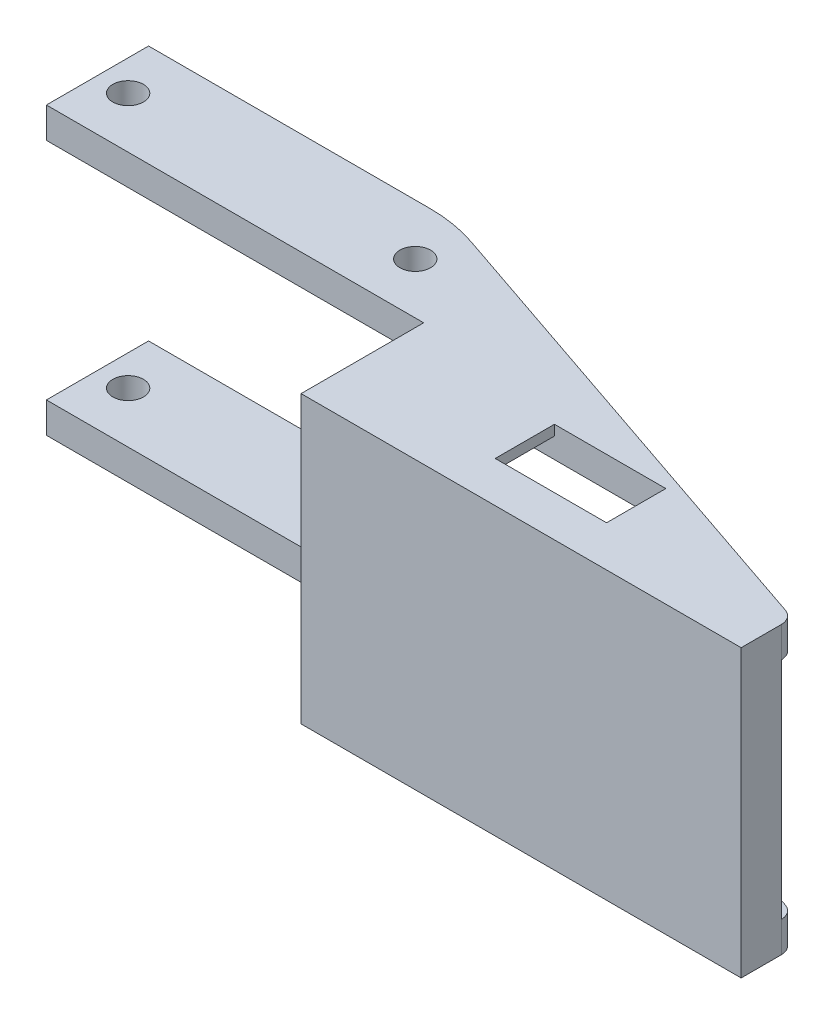
ISO-10303-21;
HEADER;
FILE_DESCRIPTION(('STEP AP214'),'2;1');
FILE_NAME('part.step','',(''),(''),'','','');
FILE_SCHEMA(('AUTOMOTIVE_DESIGN { 1 0 10303 214 1 1 1 1 }'));
ENDSEC;
DATA;
#1=APPLICATION_CONTEXT('core data for automotive mechanical design processes');
#2=APPLICATION_PROTOCOL_DEFINITION('international standard','automotive_design',2000,#1);
#3=PRODUCT_CONTEXT('',#1,'mechanical');
#4=PRODUCT('Part','Part','',(#3));
#5=PRODUCT_RELATED_PRODUCT_CATEGORY('part','',(#4));
#6=PRODUCT_DEFINITION_FORMATION('','',#4);
#7=PRODUCT_DEFINITION_CONTEXT('part definition',#1,'design');
#8=PRODUCT_DEFINITION('design','',#6,#7);
#9=PRODUCT_DEFINITION_SHAPE('','',#8);
#10=(LENGTH_UNIT() NAMED_UNIT(*) SI_UNIT(.MILLI.,.METRE.));
#11=(NAMED_UNIT(*) PLANE_ANGLE_UNIT() SI_UNIT($,.RADIAN.));
#12=(NAMED_UNIT(*) SI_UNIT($,.STERADIAN.) SOLID_ANGLE_UNIT());
#13=UNCERTAINTY_MEASURE_WITH_UNIT(LENGTH_MEASURE(1.E-05),#10,'distance_accuracy_value','');
#14=(GEOMETRIC_REPRESENTATION_CONTEXT(3) GLOBAL_UNCERTAINTY_ASSIGNED_CONTEXT((#13)) GLOBAL_UNIT_ASSIGNED_CONTEXT((#10,
#11,#12)) REPRESENTATION_CONTEXT('',''));
#15=CARTESIAN_POINT('',(0.,0.,0.));
#16=DIRECTION('',(0.,0.,1.));
#17=DIRECTION('',(1.,0.,0.));
#18=AXIS2_PLACEMENT_3D('',#15,#16,#17);
#19=CARTESIAN_POINT('',(13.,15.,2.04529828109201));
#20=DIRECTION('',(-1.,0.,0.));
#21=DIRECTION('',(0.,0.,1.));
#22=AXIS2_PLACEMENT_3D('',#19,#20,#21);
#23=PLANE('',#22);
#24=DIRECTION('',(0.,0.,-1.));
#25=VECTOR('',#24,1.);
#26=CARTESIAN_POINT('',(13.,24.,7.84529828109201));
#27=LINE('',#26,#25);
#28=CARTESIAN_POINT('',(13.,24.,7.84529828109201));
#29=VERTEX_POINT('',#28);
#30=CARTESIAN_POINT('',(13.,24.,2.04529828109201));
#31=VERTEX_POINT('',#30);
#32=EDGE_CURVE('E202',#29,#31,#27,.T.);
#33=ORIENTED_EDGE('',*,*,#32,.F.);
#34=DIRECTION('',(0.,1.,0.));
#35=VECTOR('',#34,1.);
#36=CARTESIAN_POINT('',(13.,15.,7.84529828109201));
#37=LINE('',#36,#35);
#38=CARTESIAN_POINT('',(13.,22.,7.84529828109201));
#39=VERTEX_POINT('',#38);
#40=EDGE_CURVE('E207',#39,#29,#37,.T.);
#41=ORIENTED_EDGE('',*,*,#40,.F.);
#42=DIRECTION('',(0.,0.,-1.));
#43=VECTOR('',#42,1.);
#44=CARTESIAN_POINT('',(13.,22.,4.84529828109201));
#45=LINE('',#44,#43);
#46=CARTESIAN_POINT('',(13.,22.,2.04529828109201));
#47=VERTEX_POINT('',#46);
#48=EDGE_CURVE('E233',#39,#47,#45,.T.);
#49=ORIENTED_EDGE('',*,*,#48,.T.);
#50=DIRECTION('',(0.,1.,0.));
#51=VECTOR('',#50,1.);
#52=CARTESIAN_POINT('',(13.,15.,2.04529828109201));
#53=LINE('',#52,#51);
#54=EDGE_CURVE('E220',#47,#31,#53,.T.);
#55=ORIENTED_EDGE('',*,*,#54,.T.);
#56=EDGE_LOOP('',(#33,#41,#49,#55));
#57=FACE_BOUND('',#56,.T.);
#58=ADVANCED_FACE('F33',(#57),#23,.F.);
#59=CARTESIAN_POINT('',(13.,15.,2.04529828109201));
#60=DIRECTION('',(0.,0.,-1.));
#61=DIRECTION('',(-1.,0.,0.));
#62=AXIS2_PLACEMENT_3D('',#59,#60,#61);
#63=PLANE('',#62);
#64=DIRECTION('',(-1.,0.,0.));
#65=VECTOR('',#64,1.);
#66=CARTESIAN_POINT('',(15.,24.,2.04529828109201));
#67=LINE('',#66,#65);
#68=CARTESIAN_POINT('',(15.,24.,2.04529828109201));
#69=VERTEX_POINT('',#68);
#70=EDGE_CURVE('E195',#69,#31,#67,.T.);
#71=ORIENTED_EDGE('',*,*,#70,.T.);
#72=ORIENTED_EDGE('',*,*,#54,.F.);
#73=DIRECTION('',(1.,0.,0.));
#74=VECTOR('',#73,1.);
#75=CARTESIAN_POINT('',(-9.406467809383,22.,2.04529828109201));
#76=LINE('',#75,#74);
#77=CARTESIAN_POINT('',(25.9,22.,2.04529828109201));
#78=VERTEX_POINT('',#77);
#79=EDGE_CURVE('E231',#47,#78,#76,.T.);
#80=ORIENTED_EDGE('',*,*,#79,.T.);
#81=DIRECTION('',(0.,1.,0.));
#82=VECTOR('',#81,1.);
#83=CARTESIAN_POINT('',(25.9,15.,2.04529828109201));
#84=LINE('',#83,#82);
#85=CARTESIAN_POINT('',(25.9,25.,2.04529828109201));
#86=VERTEX_POINT('',#85);
#87=EDGE_CURVE('E224',#78,#86,#84,.T.);
#88=ORIENTED_EDGE('',*,*,#87,.T.);
#89=DIRECTION('',(-1.,0.,0.));
#90=VECTOR('',#89,1.);
#91=CARTESIAN_POINT('',(13.,25.,2.04529828109201));
#92=LINE('',#91,#90);
#93=CARTESIAN_POINT('',(15.,25.,2.04529828109201));
#94=VERTEX_POINT('',#93);
#95=EDGE_CURVE('E217',#86,#94,#92,.T.);
#96=ORIENTED_EDGE('',*,*,#95,.T.);
#97=DIRECTION('',(0.,1.,0.));
#98=VECTOR('',#97,1.);
#99=CARTESIAN_POINT('',(15.,25.,2.04529828109201));
#100=LINE('',#99,#98);
#101=EDGE_CURVE('E197',#69,#94,#100,.T.);
#102=ORIENTED_EDGE('',*,*,#101,.F.);
#103=EDGE_LOOP('',(#71,#72,#80,#88,#96,#102));
#104=FACE_BOUND('',#103,.T.);
#105=ADVANCED_FACE('F473',(#104),#63,.F.);
#106=CARTESIAN_POINT('',(13.,15.,7.84529828109201));
#107=DIRECTION('',(0.,0.,1.));
#108=DIRECTION('',(1.,0.,0.));
#109=AXIS2_PLACEMENT_3D('',#106,#107,#108);
#110=PLANE('',#109);
#111=DIRECTION('',(-1.,0.,0.));
#112=VECTOR('',#111,1.);
#113=CARTESIAN_POINT('',(15.,24.,7.84529828109201));
#114=LINE('',#113,#112);
#115=CARTESIAN_POINT('',(15.,24.,7.84529828109201));
#116=VERTEX_POINT('',#115);
#117=EDGE_CURVE('E192',#116,#29,#114,.T.);
#118=ORIENTED_EDGE('',*,*,#117,.F.);
#119=DIRECTION('',(0.,-1.,0.));
#120=VECTOR('',#119,1.);
#121=CARTESIAN_POINT('',(15.,25.,7.84529828109201));
#122=LINE('',#121,#120);
#123=CARTESIAN_POINT('',(15.,25.,7.84529828109201));
#124=VERTEX_POINT('',#123);
#125=EDGE_CURVE('E198',#124,#116,#122,.T.);
#126=ORIENTED_EDGE('',*,*,#125,.F.);
#127=DIRECTION('',(1.,0.,0.));
#128=VECTOR('',#127,1.);
#129=CARTESIAN_POINT('',(13.,25.,7.84529828109201));
#130=LINE('',#129,#128);
#131=CARTESIAN_POINT('',(25.9,25.,7.84529828109201));
#132=VERTEX_POINT('',#131);
#133=EDGE_CURVE('E208',#124,#132,#130,.T.);
#134=ORIENTED_EDGE('',*,*,#133,.T.);
#135=DIRECTION('',(0.,1.,0.));
#136=VECTOR('',#135,1.);
#137=CARTESIAN_POINT('',(25.9,15.,7.84529828109201));
#138=LINE('',#137,#136);
#139=CARTESIAN_POINT('',(25.9,22.,7.84529828109201));
#140=VERTEX_POINT('',#139);
#141=EDGE_CURVE('E58',#140,#132,#138,.T.);
#142=ORIENTED_EDGE('',*,*,#141,.F.);
#143=DIRECTION('',(-1.,0.,0.));
#144=VECTOR('',#143,1.);
#145=CARTESIAN_POINT('',(-9.406467809383,22.,7.84529828109201));
#146=LINE('',#145,#144);
#147=EDGE_CURVE('E223',#140,#39,#146,.T.);
#148=ORIENTED_EDGE('',*,*,#147,.T.);
#149=ORIENTED_EDGE('',*,*,#40,.T.);
#150=EDGE_LOOP('',(#118,#126,#134,#142,#148,#149));
#151=FACE_BOUND('',#150,.T.);
#152=ADVANCED_FACE('F205',(#151),#110,.F.);
#153=CARTESIAN_POINT('',(-9.406467809383,0.,4.84529828109201));
#154=DIRECTION('',(0.,-1.,0.));
#155=DIRECTION('',(0.,0.,-1.));
#156=AXIS2_PLACEMENT_3D('',#153,#154,#155);
#157=PLANE('',#156);
#158=CARTESIAN_POINT('',(-5.82618806875632,0.,-5.15470171890799));
#159=DIRECTION('',(0.,-1.,0.));
#160=DIRECTION('',(0.,0.,-1.));
#161=AXIS2_PLACEMENT_3D('',#158,#159,#160);
#162=CIRCLE('',#161,1.5);
#163=CARTESIAN_POINT('',(-5.82618806875632,0.,-6.65470171890798));
#164=VERTEX_POINT('',#163);
#165=EDGE_CURVE('E321',#164,#164,#162,.T.);
#166=ORIENTED_EDGE('',*,*,#165,.T.);
#167=EDGE_LOOP('',(#166));
#168=FACE_BOUND('',#167,.T.);
#169=CARTESIAN_POINT('',(-33.9261880687563,0.,-5.15470171890799));
#170=DIRECTION('',(0.,-1.,0.));
#171=DIRECTION('',(0.,0.,-1.));
#172=AXIS2_PLACEMENT_3D('',#169,#170,#171);
#173=CIRCLE('',#172,1.49999999999999);
#174=CARTESIAN_POINT('',(-33.9261880687563,0.,-6.65470171890798));
#175=VERTEX_POINT('',#174);
#176=EDGE_CURVE('E37',#175,#175,#173,.T.);
#177=ORIENTED_EDGE('',*,*,#176,.T.);
#178=EDGE_LOOP('',(#177));
#179=FACE_BOUND('',#178,.T.);
#180=DIRECTION('',(-1.,0.,0.));
#181=VECTOR('',#180,1.);
#182=CARTESIAN_POINT('',(0.,0.,7.91962779227332));
#183=LINE('',#182,#181);
#184=CARTESIAN_POINT('',(43.0738119312437,0.,7.91962779227332));
#185=VERTEX_POINT('',#184);
#186=CARTESIAN_POINT('',(0.,0.,7.91962779227332));
#187=VERTEX_POINT('',#186);
#188=EDGE_CURVE('E303',#185,#187,#183,.T.);
#189=ORIENTED_EDGE('',*,*,#188,.F.);
#190=CARTESIAN_POINT('',(41.5738119312437,0.,7.91962779227332));
#191=DIRECTION('',(0.,1.,0.));
#192=DIRECTION('',(0.,0.,-1.));
#193=AXIS2_PLACEMENT_3D('',#190,#191,#192);
#194=CIRCLE('',#193,1.5);
#195=CARTESIAN_POINT('',(42.0566660311017,0.,6.49946867504375));
#196=VERTEX_POINT('',#195);
#197=EDGE_CURVE('E324',#185,#196,#194,.T.);
#198=ORIENTED_EDGE('',*,*,#197,.T.);
#199=DIRECTION('',(-0.946772744819713,0.,-0.321902733238702));
#200=VECTOR('',#199,1.);
#201=CARTESIAN_POINT('',(-4.57792681080247,0.,-9.35629289120368));
#202=LINE('',#201,#200);
#203=CARTESIAN_POINT('',(-4.57792681080247,0.,-9.35629289120368));
#204=VERTEX_POINT('',#203);
#205=EDGE_CURVE('E356',#196,#204,#202,.T.);
#206=ORIENTED_EDGE('',*,*,#205,.T.);
#207=CARTESIAN_POINT('',(-9.406467809383,0.,4.84529828109201));
#208=DIRECTION('',(0.,1.,0.));
#209=DIRECTION('',(0.,0.,-1.));
#210=AXIS2_PLACEMENT_3D('',#207,#208,#209);
#211=CIRCLE('',#210,15.);
#212=CARTESIAN_POINT('',(-9.406467809383,0.,-10.154701718908));
#213=VERTEX_POINT('',#212);
#214=EDGE_CURVE('E359',#204,#213,#211,.T.);
#215=ORIENTED_EDGE('',*,*,#214,.T.);
#216=DIRECTION('',(-1.,0.,0.));
#217=VECTOR('',#216,1.);
#218=CARTESIAN_POINT('',(-36.9261880687563,0.,-10.154701718908));
#219=LINE('',#218,#217);
#220=CARTESIAN_POINT('',(-36.9261880687563,0.,-10.154701718908));
#221=VERTEX_POINT('',#220);
#222=EDGE_CURVE('E362',#213,#221,#219,.T.);
#223=ORIENTED_EDGE('',*,*,#222,.T.);
#224=DIRECTION('',(0.,0.,1.));
#225=VECTOR('',#224,1.);
#226=CARTESIAN_POINT('',(-36.9261880687563,0.,-10.154701718908));
#227=LINE('',#226,#225);
#228=CARTESIAN_POINT('',(-36.9261880687563,0.,-0.154701718907987));
#229=VERTEX_POINT('',#228);
#230=EDGE_CURVE('E365',#221,#229,#227,.T.);
#231=ORIENTED_EDGE('',*,*,#230,.T.);
#232=DIRECTION('',(1.,0.,0.));
#233=VECTOR('',#232,1.);
#234=CARTESIAN_POINT('',(-36.9261880687563,0.,-0.154701718907987));
#235=LINE('',#234,#233);
#236=CARTESIAN_POINT('',(0.,0.,-0.154701718907987));
#237=VERTEX_POINT('',#236);
#238=EDGE_CURVE('E368',#229,#237,#235,.T.);
#239=ORIENTED_EDGE('',*,*,#238,.T.);
#240=DIRECTION('',(0.,0.,1.));
#241=VECTOR('',#240,1.);
#242=CARTESIAN_POINT('',(0.,0.,11.845298281092));
#243=LINE('',#242,#241);
#244=EDGE_CURVE('E329',#237,#187,#243,.T.);
#245=ORIENTED_EDGE('',*,*,#244,.T.);
#246=EDGE_LOOP('',(#189,#198,#206,#215,#223,#231,#239,#245));
#247=FACE_BOUND('',#246,.T.);
#248=ADVANCED_FACE('F451',(#168,#179,#247),#157,.F.);
#249=CARTESIAN_POINT('',(43.0738119312437,-3.,7.91962779227332));
#250=DIRECTION('',(1.,0.,0.));
#251=DIRECTION('',(0.,0.,-1.));
#252=AXIS2_PLACEMENT_3D('',#249,#250,#251);
#253=PLANE('',#252);
#254=DIRECTION('',(0.,1.,0.));
#255=VECTOR('',#254,1.);
#256=CARTESIAN_POINT('',(43.0738119312437,-3.,7.91962779227332));
#257=LINE('',#256,#255);
#258=CARTESIAN_POINT('',(43.0738119312437,-3.,7.91962779227332));
#259=VERTEX_POINT('',#258);
#260=EDGE_CURVE('E353',#259,#185,#257,.T.);
#261=ORIENTED_EDGE('',*,*,#260,.T.);
#262=DIRECTION('',(0.,-1.,0.));
#263=VECTOR('',#262,1.);
#264=CARTESIAN_POINT('',(43.0738119312437,65.2523313021961,7.91962779227332));
#265=LINE('',#264,#263);
#266=CARTESIAN_POINT('',(43.0738119312437,22.,7.91962779227332));
#267=VERTEX_POINT('',#266);
#268=EDGE_CURVE('E309',#267,#185,#265,.T.);
#269=ORIENTED_EDGE('',*,*,#268,.F.);
#270=DIRECTION('',(0.,-1.,0.));
#271=VECTOR('',#270,1.);
#272=CARTESIAN_POINT('',(43.0738119312437,25.,7.91962779227332));
#273=LINE('',#272,#271);
#274=CARTESIAN_POINT('',(43.0738119312437,25.,7.91962779227332));
#275=VERTEX_POINT('',#274);
#276=EDGE_CURVE('E301',#275,#267,#273,.T.);
#277=ORIENTED_EDGE('',*,*,#276,.F.);
#278=DIRECTION('',(0.,0.,-1.));
#279=VECTOR('',#278,1.);
#280=CARTESIAN_POINT('',(43.0738119312437,25.,7.91962779227332));
#281=LINE('',#280,#279);
#282=CARTESIAN_POINT('',(43.0738119312437,25.,11.845298281092));
#283=VERTEX_POINT('',#282);
#284=EDGE_CURVE('E248',#283,#275,#281,.T.);
#285=ORIENTED_EDGE('',*,*,#284,.F.);
#286=DIRECTION('',(0.,1.,0.));
#287=VECTOR('',#286,1.);
#288=CARTESIAN_POINT('',(43.0738119312437,-3.,11.845298281092));
#289=LINE('',#288,#287);
#290=CARTESIAN_POINT('',(43.0738119312437,-3.,11.845298281092));
#291=VERTEX_POINT('',#290);
#292=EDGE_CURVE('E11',#291,#283,#289,.T.);
#293=ORIENTED_EDGE('',*,*,#292,.F.);
#294=DIRECTION('',(0.,0.,-1.));
#295=VECTOR('',#294,1.);
#296=CARTESIAN_POINT('',(43.0738119312437,-3.,7.91962779227332));
#297=LINE('',#296,#295);
#298=EDGE_CURVE('E325',#291,#259,#297,.T.);
#299=ORIENTED_EDGE('',*,*,#298,.T.);
#300=EDGE_LOOP('',(#261,#269,#277,#285,#293,#299));
#301=FACE_BOUND('',#300,.T.);
#302=ADVANCED_FACE('F35',(#301),#253,.T.);
#303=CARTESIAN_POINT('',(0.,-3.,11.845298281092));
#304=DIRECTION('',(0.,0.,1.));
#305=DIRECTION('',(1.,0.,0.));
#306=AXIS2_PLACEMENT_3D('',#303,#304,#305);
#307=PLANE('',#306);
#308=ORIENTED_EDGE('',*,*,#292,.T.);
#309=DIRECTION('',(1.,0.,0.));
#310=VECTOR('',#309,1.);
#311=CARTESIAN_POINT('',(0.,25.,11.845298281092));
#312=LINE('',#311,#310);
#313=CARTESIAN_POINT('',(0.,25.,11.845298281092));
#314=VERTEX_POINT('',#313);
#315=EDGE_CURVE('E267',#314,#283,#312,.T.);
#316=ORIENTED_EDGE('',*,*,#315,.F.);
#317=DIRECTION('',(0.,1.,0.));
#318=VECTOR('',#317,1.);
#319=CARTESIAN_POINT('',(0.,-3.,11.845298281092));
#320=LINE('',#319,#318);
#321=CARTESIAN_POINT('',(0.,-3.,11.845298281092));
#322=VERTEX_POINT('',#321);
#323=EDGE_CURVE('E42',#322,#314,#320,.T.);
#324=ORIENTED_EDGE('',*,*,#323,.F.);
#325=DIRECTION('',(1.,0.,0.));
#326=VECTOR('',#325,1.);
#327=CARTESIAN_POINT('',(0.,-3.,11.845298281092));
#328=LINE('',#327,#326);
#329=EDGE_CURVE('E350',#322,#291,#328,.T.);
#330=ORIENTED_EDGE('',*,*,#329,.T.);
#331=EDGE_LOOP('',(#308,#316,#324,#330));
#332=FACE_BOUND('',#331,.T.);
#333=ADVANCED_FACE('F439',(#332),#307,.T.);
#334=CARTESIAN_POINT('',(0.,-3.,11.845298281092));
#335=DIRECTION('',(-1.,0.,0.));
#336=DIRECTION('',(0.,0.,1.));
#337=AXIS2_PLACEMENT_3D('',#334,#335,#336);
#338=PLANE('',#337);
#339=ORIENTED_EDGE('',*,*,#244,.F.);
#340=DIRECTION('',(0.,1.,0.));
#341=VECTOR('',#340,1.);
#342=CARTESIAN_POINT('',(0.,-3.,-0.154701718907987));
#343=LINE('',#342,#341);
#344=CARTESIAN_POINT('',(0.,-3.,-0.154701718907987));
#345=VERTEX_POINT('',#344);
#346=EDGE_CURVE('E373',#345,#237,#343,.T.);
#347=ORIENTED_EDGE('',*,*,#346,.F.);
#348=DIRECTION('',(0.,0.,1.));
#349=VECTOR('',#348,1.);
#350=CARTESIAN_POINT('',(0.,-3.,11.845298281092));
#351=LINE('',#350,#349);
#352=EDGE_CURVE('E347',#345,#322,#351,.T.);
#353=ORIENTED_EDGE('',*,*,#352,.T.);
#354=ORIENTED_EDGE('',*,*,#323,.T.);
#355=DIRECTION('',(0.,0.,1.));
#356=VECTOR('',#355,1.);
#357=CARTESIAN_POINT('',(0.,25.,11.845298281092));
#358=LINE('',#357,#356);
#359=CARTESIAN_POINT('',(0.,25.,-0.154701718907987));
#360=VERTEX_POINT('',#359);
#361=EDGE_CURVE('E264',#360,#314,#358,.T.);
#362=ORIENTED_EDGE('',*,*,#361,.F.);
#363=DIRECTION('',(0.,-1.,0.));
#364=VECTOR('',#363,1.);
#365=CARTESIAN_POINT('',(0.,25.,-0.154701718907987));
#366=LINE('',#365,#364);
#367=CARTESIAN_POINT('',(0.,22.,-0.154701718907987));
#368=VERTEX_POINT('',#367);
#369=EDGE_CURVE('E270',#360,#368,#366,.T.);
#370=ORIENTED_EDGE('',*,*,#369,.T.);
#371=DIRECTION('',(0.,0.,1.));
#372=VECTOR('',#371,1.);
#373=CARTESIAN_POINT('',(0.,22.,11.845298281092));
#374=LINE('',#373,#372);
#375=CARTESIAN_POINT('',(0.,22.,7.91962779227332));
#376=VERTEX_POINT('',#375);
#377=EDGE_CURVE('E252',#368,#376,#374,.T.);
#378=ORIENTED_EDGE('',*,*,#377,.T.);
#379=DIRECTION('',(0.,-1.,0.));
#380=VECTOR('',#379,1.);
#381=CARTESIAN_POINT('',(0.,65.2523313021961,7.91962779227332));
#382=LINE('',#381,#380);
#383=EDGE_CURVE('E306',#376,#187,#382,.T.);
#384=ORIENTED_EDGE('',*,*,#383,.T.);
#385=EDGE_LOOP('',(#339,#347,#353,#354,#362,#370,#378,#384));
#386=FACE_BOUND('',#385,.T.);
#387=ADVANCED_FACE('F406',(#386),#338,.T.);
#388=CARTESIAN_POINT('',(-36.9261880687563,-3.,-0.154701718907987));
#389=DIRECTION('',(0.,0.,1.));
#390=DIRECTION('',(1.,0.,0.));
#391=AXIS2_PLACEMENT_3D('',#388,#389,#390);
#392=PLANE('',#391);
#393=ORIENTED_EDGE('',*,*,#238,.F.);
#394=DIRECTION('',(0.,1.,0.));
#395=VECTOR('',#394,1.);
#396=CARTESIAN_POINT('',(-36.9261880687563,-3.,-0.154701718907987));
#397=LINE('',#396,#395);
#398=CARTESIAN_POINT('',(-36.9261880687563,-3.,-0.154701718907987));
#399=VERTEX_POINT('',#398);
#400=EDGE_CURVE('E375',#399,#229,#397,.T.);
#401=ORIENTED_EDGE('',*,*,#400,.F.);
#402=DIRECTION('',(1.,0.,0.));
#403=VECTOR('',#402,1.);
#404=CARTESIAN_POINT('',(-36.9261880687563,-3.,-0.154701718907987));
#405=LINE('',#404,#403);
#406=EDGE_CURVE('E344',#399,#345,#405,.T.);
#407=ORIENTED_EDGE('',*,*,#406,.T.);
#408=ORIENTED_EDGE('',*,*,#346,.T.);
#409=EDGE_LOOP('',(#393,#401,#407,#408));
#410=FACE_BOUND('',#409,.T.);
#411=ADVANCED_FACE('F463',(#410),#392,.T.);
#412=CARTESIAN_POINT('',(-36.9261880687563,-3.,-10.154701718908));
#413=DIRECTION('',(-1.,0.,0.));
#414=DIRECTION('',(0.,0.,1.));
#415=AXIS2_PLACEMENT_3D('',#412,#413,#414);
#416=PLANE('',#415);
#417=ORIENTED_EDGE('',*,*,#230,.F.);
#418=DIRECTION('',(0.,1.,0.));
#419=VECTOR('',#418,1.);
#420=CARTESIAN_POINT('',(-36.9261880687563,-3.,-10.154701718908));
#421=LINE('',#420,#419);
#422=CARTESIAN_POINT('',(-36.9261880687563,-3.,-10.154701718908));
#423=VERTEX_POINT('',#422);
#424=EDGE_CURVE('E377',#423,#221,#421,.T.);
#425=ORIENTED_EDGE('',*,*,#424,.F.);
#426=DIRECTION('',(0.,0.,1.));
#427=VECTOR('',#426,1.);
#428=CARTESIAN_POINT('',(-36.9261880687563,-3.,-10.154701718908));
#429=LINE('',#428,#427);
#430=EDGE_CURVE('E341',#423,#399,#429,.T.);
#431=ORIENTED_EDGE('',*,*,#430,.T.);
#432=ORIENTED_EDGE('',*,*,#400,.T.);
#433=EDGE_LOOP('',(#417,#425,#431,#432));
#434=FACE_BOUND('',#433,.T.);
#435=ADVANCED_FACE('F460',(#434),#416,.T.);
#436=CARTESIAN_POINT('',(-36.9261880687563,-3.,-10.154701718908));
#437=DIRECTION('',(0.,0.,-1.));
#438=DIRECTION('',(-1.,0.,0.));
#439=AXIS2_PLACEMENT_3D('',#436,#437,#438);
#440=PLANE('',#439);
#441=ORIENTED_EDGE('',*,*,#222,.F.);
#442=DIRECTION('',(0.,1.,0.));
#443=VECTOR('',#442,1.);
#444=CARTESIAN_POINT('',(-9.406467809383,-3.,-10.154701718908));
#445=LINE('',#444,#443);
#446=CARTESIAN_POINT('',(-9.406467809383,-3.,-10.154701718908));
#447=VERTEX_POINT('',#446);
#448=EDGE_CURVE('E379',#447,#213,#445,.T.);
#449=ORIENTED_EDGE('',*,*,#448,.F.);
#450=DIRECTION('',(-1.,0.,0.));
#451=VECTOR('',#450,1.);
#452=CARTESIAN_POINT('',(-36.9261880687563,-3.,-10.154701718908));
#453=LINE('',#452,#451);
#454=EDGE_CURVE('E338',#447,#423,#453,.T.);
#455=ORIENTED_EDGE('',*,*,#454,.T.);
#456=ORIENTED_EDGE('',*,*,#424,.T.);
#457=EDGE_LOOP('',(#441,#449,#455,#456));
#458=FACE_BOUND('',#457,.T.);
#459=ADVANCED_FACE('F456',(#458),#440,.T.);
#460=CARTESIAN_POINT('',(-9.406467809383,-3.,4.84529828109201));
#461=DIRECTION('',(0.,1.,0.));
#462=DIRECTION('',(0.,0.,1.));
#463=AXIS2_PLACEMENT_3D('',#460,#461,#462);
#464=CYLINDRICAL_SURFACE('',#463,15.);
#465=ORIENTED_EDGE('',*,*,#214,.F.);
#466=DIRECTION('',(0.,1.,0.));
#467=VECTOR('',#466,1.);
#468=CARTESIAN_POINT('',(-4.57792681080247,-3.,-9.35629289120368));
#469=LINE('',#468,#467);
#470=CARTESIAN_POINT('',(-4.57792681080247,-3.,-9.35629289120368));
#471=VERTEX_POINT('',#470);
#472=EDGE_CURVE('E381',#471,#204,#469,.T.);
#473=ORIENTED_EDGE('',*,*,#472,.F.);
#474=CARTESIAN_POINT('',(-9.406467809383,-3.,4.84529828109201));
#475=DIRECTION('',(0.,1.,0.));
#476=DIRECTION('',(0.,0.,-1.));
#477=AXIS2_PLACEMENT_3D('',#474,#475,#476);
#478=CIRCLE('',#477,15.);
#479=EDGE_CURVE('E335',#471,#447,#478,.T.);
#480=ORIENTED_EDGE('',*,*,#479,.T.);
#481=ORIENTED_EDGE('',*,*,#448,.T.);
#482=EDGE_LOOP('',(#465,#473,#480,#481));
#483=FACE_BOUND('',#482,.T.);
#484=ADVANCED_FACE('F454',(#483),#464,.T.);
#485=CARTESIAN_POINT('',(-4.57792681080247,-3.,-9.35629289120368));
#486=DIRECTION('',(0.321902733238702,0.,-0.946772744819713));
#487=DIRECTION('',(-0.946772744819713,0.,-0.321902733238702));
#488=AXIS2_PLACEMENT_3D('',#485,#486,#487);
#489=PLANE('',#488);
#490=ORIENTED_EDGE('',*,*,#205,.F.);
#491=DIRECTION('',(0.,1.,0.));
#492=VECTOR('',#491,1.);
#493=CARTESIAN_POINT('',(42.0566660311017,-3.,6.49946867504375));
#494=LINE('',#493,#492);
#495=CARTESIAN_POINT('',(42.0566660311017,-3.,6.49946867504375));
#496=VERTEX_POINT('',#495);
#497=EDGE_CURVE('E383',#496,#196,#494,.T.);
#498=ORIENTED_EDGE('',*,*,#497,.F.);
#499=DIRECTION('',(-0.946772744819713,0.,-0.321902733238702));
#500=VECTOR('',#499,1.);
#501=CARTESIAN_POINT('',(-4.57792681080247,-3.,-9.35629289120368));
#502=LINE('',#501,#500);
#503=EDGE_CURVE('E332',#496,#471,#502,.T.);
#504=ORIENTED_EDGE('',*,*,#503,.T.);
#505=ORIENTED_EDGE('',*,*,#472,.T.);
#506=EDGE_LOOP('',(#490,#498,#504,#505));
#507=FACE_BOUND('',#506,.T.);
#508=ADVANCED_FACE('F449',(#507),#489,.T.);
#509=CARTESIAN_POINT('',(41.5738119312437,-3.,7.91962779227332));
#510=DIRECTION('',(0.,1.,0.));
#511=DIRECTION('',(0.,0.,1.));
#512=AXIS2_PLACEMENT_3D('',#509,#510,#511);
#513=CYLINDRICAL_SURFACE('',#512,1.5);
#514=ORIENTED_EDGE('',*,*,#197,.F.);
#515=ORIENTED_EDGE('',*,*,#260,.F.);
#516=CARTESIAN_POINT('',(41.5738119312437,-3.,7.91962779227332));
#517=DIRECTION('',(0.,1.,0.));
#518=DIRECTION('',(0.,0.,-1.));
#519=AXIS2_PLACEMENT_3D('',#516,#517,#518);
#520=CIRCLE('',#519,1.5);
#521=EDGE_CURVE('E328',#259,#496,#520,.T.);
#522=ORIENTED_EDGE('',*,*,#521,.T.);
#523=ORIENTED_EDGE('',*,*,#497,.T.);
#524=EDGE_LOOP('',(#514,#515,#522,#523));
#525=FACE_BOUND('',#524,.T.);
#526=ADVANCED_FACE('F392',(#525),#513,.T.);
#527=CARTESIAN_POINT('',(-9.406467809383,-3.,4.84529828109201));
#528=DIRECTION('',(0.,-1.,0.));
#529=DIRECTION('',(0.,0.,-1.));
#530=AXIS2_PLACEMENT_3D('',#527,#528,#529);
#531=PLANE('',#530);
#532=CARTESIAN_POINT('',(-33.9261880687563,-3.,-5.15470171890799));
#533=DIRECTION('',(0.,-1.,0.));
#534=DIRECTION('',(0.,0.,-1.));
#535=AXIS2_PLACEMENT_3D('',#532,#533,#534);
#536=CIRCLE('',#535,1.49999999999999);
#537=CARTESIAN_POINT('',(-33.9261880687563,-3.,-6.65470171890798));
#538=VERTEX_POINT('',#537);
#539=EDGE_CURVE('E315',#538,#538,#536,.T.);
#540=ORIENTED_EDGE('',*,*,#539,.F.);
#541=EDGE_LOOP('',(#540));
#542=FACE_BOUND('',#541,.T.);
#543=CARTESIAN_POINT('',(-5.82618806875632,-3.,-5.15470171890799));
#544=DIRECTION('',(0.,-1.,0.));
#545=DIRECTION('',(0.,0.,-1.));
#546=AXIS2_PLACEMENT_3D('',#543,#544,#545);
#547=CIRCLE('',#546,1.5);
#548=CARTESIAN_POINT('',(-5.82618806875632,-3.,-6.65470171890798));
#549=VERTEX_POINT('',#548);
#550=EDGE_CURVE('E318',#549,#549,#547,.T.);
#551=ORIENTED_EDGE('',*,*,#550,.F.);
#552=EDGE_LOOP('',(#551));
#553=FACE_BOUND('',#552,.T.);
#554=ORIENTED_EDGE('',*,*,#298,.F.);
#555=ORIENTED_EDGE('',*,*,#329,.F.);
#556=ORIENTED_EDGE('',*,*,#352,.F.);
#557=ORIENTED_EDGE('',*,*,#406,.F.);
#558=ORIENTED_EDGE('',*,*,#430,.F.);
#559=ORIENTED_EDGE('',*,*,#454,.F.);
#560=ORIENTED_EDGE('',*,*,#479,.F.);
#561=ORIENTED_EDGE('',*,*,#503,.F.);
#562=ORIENTED_EDGE('',*,*,#521,.F.);
#563=EDGE_LOOP('',(#554,#555,#556,#557,#558,#559,#560,#561,#562));
#564=FACE_BOUND('',#563,.T.);
#565=ADVANCED_FACE('F443',(#542,#553,#564),#531,.T.);
#566=CARTESIAN_POINT('',(-5.82618806875632,-3.,-5.15470171890799));
#567=DIRECTION('',(0.,-1.,0.));
#568=DIRECTION('',(0.,0.,-1.));
#569=AXIS2_PLACEMENT_3D('',#566,#567,#568);
#570=CYLINDRICAL_SURFACE('',#569,1.5);
#571=ORIENTED_EDGE('',*,*,#550,.T.);
#572=EDGE_LOOP('',(#571));
#573=FACE_BOUND('',#572,.T.);
#574=ORIENTED_EDGE('',*,*,#165,.F.);
#575=EDGE_LOOP('',(#574));
#576=FACE_BOUND('',#575,.T.);
#577=ADVANCED_FACE('F516',(#573,#576),#570,.F.);
#578=CARTESIAN_POINT('',(-33.9261880687563,-3.,-5.15470171890799));
#579=DIRECTION('',(0.,-1.,0.));
#580=DIRECTION('',(0.,0.,-1.));
#581=AXIS2_PLACEMENT_3D('',#578,#579,#580);
#582=CYLINDRICAL_SURFACE('',#581,1.49999999999999);
#583=ORIENTED_EDGE('',*,*,#539,.T.);
#584=EDGE_LOOP('',(#583));
#585=FACE_BOUND('',#584,.T.);
#586=ORIENTED_EDGE('',*,*,#176,.F.);
#587=EDGE_LOOP('',(#586));
#588=FACE_BOUND('',#587,.T.);
#589=ADVANCED_FACE('F513',(#585,#588),#582,.F.);
#590=CARTESIAN_POINT('',(0.,65.2523313021961,7.91962779227332));
#591=DIRECTION('',(0.,0.,1.));
#592=DIRECTION('',(1.,0.,0.));
#593=AXIS2_PLACEMENT_3D('',#590,#591,#592);
#594=PLANE('',#593);
#595=ORIENTED_EDGE('',*,*,#383,.F.);
#596=DIRECTION('',(1.,0.,0.));
#597=VECTOR('',#596,1.);
#598=CARTESIAN_POINT('',(0.,22.,7.91962779227332));
#599=LINE('',#598,#597);
#600=EDGE_CURVE('E312',#376,#267,#599,.T.);
#601=ORIENTED_EDGE('',*,*,#600,.T.);
#602=ORIENTED_EDGE('',*,*,#268,.T.);
#603=ORIENTED_EDGE('',*,*,#188,.T.);
#604=EDGE_LOOP('',(#595,#601,#602,#603));
#605=FACE_BOUND('',#604,.T.);
#606=ADVANCED_FACE('F397',(#605),#594,.F.);
#607=CARTESIAN_POINT('',(-9.406467809383,22.,4.84529828109201));
#608=DIRECTION('',(0.,-1.,0.));
#609=DIRECTION('',(0.,0.,-1.));
#610=AXIS2_PLACEMENT_3D('',#607,#608,#609);
#611=PLANE('',#610);
#612=ORIENTED_EDGE('',*,*,#48,.F.);
#613=ORIENTED_EDGE('',*,*,#147,.F.);
#614=DIRECTION('',(0.,0.,1.));
#615=VECTOR('',#614,1.);
#616=CARTESIAN_POINT('',(25.9,22.,4.84529828109201));
#617=LINE('',#616,#615);
#618=EDGE_CURVE('E229',#78,#140,#617,.T.);
#619=ORIENTED_EDGE('',*,*,#618,.F.);
#620=ORIENTED_EDGE('',*,*,#79,.F.);
#621=EDGE_LOOP('',(#612,#613,#619,#620));
#622=FACE_BOUND('',#621,.T.);
#623=CARTESIAN_POINT('',(-5.82618806875632,22.,-5.15470171890799));
#624=DIRECTION('',(0.,-1.,0.));
#625=DIRECTION('',(0.,0.,-1.));
#626=AXIS2_PLACEMENT_3D('',#623,#624,#625);
#627=CIRCLE('',#626,1.5);
#628=CARTESIAN_POINT('',(-5.82618806875632,22.,-6.65470171890798));
#629=VERTEX_POINT('',#628);
#630=EDGE_CURVE('E244',#629,#629,#627,.T.);
#631=ORIENTED_EDGE('',*,*,#630,.F.);
#632=EDGE_LOOP('',(#631));
#633=FACE_BOUND('',#632,.T.);
#634=CARTESIAN_POINT('',(-33.9261880687563,22.,-5.15470171890799));
#635=DIRECTION('',(0.,-1.,0.));
#636=DIRECTION('',(0.,0.,-1.));
#637=AXIS2_PLACEMENT_3D('',#634,#635,#636);
#638=CIRCLE('',#637,1.49999999999999);
#639=CARTESIAN_POINT('',(-33.9261880687563,22.,-6.65470171890798));
#640=VERTEX_POINT('',#639);
#641=EDGE_CURVE('E238',#640,#640,#638,.T.);
#642=ORIENTED_EDGE('',*,*,#641,.F.);
#643=EDGE_LOOP('',(#642));
#644=FACE_BOUND('',#643,.T.);
#645=ORIENTED_EDGE('',*,*,#600,.F.);
#646=ORIENTED_EDGE('',*,*,#377,.F.);
#647=DIRECTION('',(1.,0.,0.));
#648=VECTOR('',#647,1.);
#649=CARTESIAN_POINT('',(-36.9261880687563,22.,-0.154701718907987));
#650=LINE('',#649,#648);
#651=CARTESIAN_POINT('',(-36.9261880687563,22.,-0.154701718907987));
#652=VERTEX_POINT('',#651);
#653=EDGE_CURVE('E280',#652,#368,#650,.T.);
#654=ORIENTED_EDGE('',*,*,#653,.F.);
#655=DIRECTION('',(0.,0.,1.));
#656=VECTOR('',#655,1.);
#657=CARTESIAN_POINT('',(-36.9261880687563,22.,-10.154701718908));
#658=LINE('',#657,#656);
#659=CARTESIAN_POINT('',(-36.9261880687563,22.,-10.154701718908));
#660=VERTEX_POINT('',#659);
#661=EDGE_CURVE('E278',#660,#652,#658,.T.);
#662=ORIENTED_EDGE('',*,*,#661,.F.);
#663=DIRECTION('',(-1.,0.,0.));
#664=VECTOR('',#663,1.);
#665=CARTESIAN_POINT('',(-36.9261880687563,22.,-10.154701718908));
#666=LINE('',#665,#664);
#667=CARTESIAN_POINT('',(-9.406467809383,22.,-10.154701718908));
#668=VERTEX_POINT('',#667);
#669=EDGE_CURVE('E276',#668,#660,#666,.T.);
#670=ORIENTED_EDGE('',*,*,#669,.F.);
#671=CARTESIAN_POINT('',(-9.406467809383,22.,4.84529828109201));
#672=DIRECTION('',(0.,1.,0.));
#673=DIRECTION('',(0.,0.,-1.));
#674=AXIS2_PLACEMENT_3D('',#671,#672,#673);
#675=CIRCLE('',#674,15.);
#676=CARTESIAN_POINT('',(-4.57792681080247,22.,-9.35629289120368));
#677=VERTEX_POINT('',#676);
#678=EDGE_CURVE('E274',#677,#668,#675,.T.);
#679=ORIENTED_EDGE('',*,*,#678,.F.);
#680=DIRECTION('',(-0.946772744819713,0.,-0.321902733238702));
#681=VECTOR('',#680,1.);
#682=CARTESIAN_POINT('',(-4.57792681080247,22.,-9.35629289120368));
#683=LINE('',#682,#681);
#684=CARTESIAN_POINT('',(42.0566660311017,22.,6.49946867504375));
#685=VERTEX_POINT('',#684);
#686=EDGE_CURVE('E272',#685,#677,#683,.T.);
#687=ORIENTED_EDGE('',*,*,#686,.F.);
#688=CARTESIAN_POINT('',(41.5738119312437,22.,7.91962779227332));
#689=DIRECTION('',(0.,1.,0.));
#690=DIRECTION('',(0.,0.,-1.));
#691=AXIS2_PLACEMENT_3D('',#688,#689,#690);
#692=CIRCLE('',#691,1.5);
#693=EDGE_CURVE('E247',#267,#685,#692,.T.);
#694=ORIENTED_EDGE('',*,*,#693,.F.);
#695=EDGE_LOOP('',(#645,#646,#654,#662,#670,#679,#687,#694));
#696=FACE_BOUND('',#695,.T.);
#697=ADVANCED_FACE('F401',(#622,#633,#644,#696),#611,.T.);
#698=CARTESIAN_POINT('',(41.5738119312437,25.,7.91962779227332));
#699=DIRECTION('',(0.,-1.,0.));
#700=DIRECTION('',(0.,0.,-1.));
#701=AXIS2_PLACEMENT_3D('',#698,#699,#700);
#702=CYLINDRICAL_SURFACE('',#701,1.5);
#703=ORIENTED_EDGE('',*,*,#693,.T.);
#704=DIRECTION('',(0.,-1.,0.));
#705=VECTOR('',#704,1.);
#706=CARTESIAN_POINT('',(42.0566660311017,25.,6.49946867504375));
#707=LINE('',#706,#705);
#708=CARTESIAN_POINT('',(42.0566660311017,25.,6.49946867504375));
#709=VERTEX_POINT('',#708);
#710=EDGE_CURVE('E298',#709,#685,#707,.T.);
#711=ORIENTED_EDGE('',*,*,#710,.F.);
#712=CARTESIAN_POINT('',(41.5738119312437,25.,7.91962779227332));
#713=DIRECTION('',(0.,1.,0.));
#714=DIRECTION('',(0.,0.,-1.));
#715=AXIS2_PLACEMENT_3D('',#712,#713,#714);
#716=CIRCLE('',#715,1.5);
#717=EDGE_CURVE('E251',#275,#709,#716,.T.);
#718=ORIENTED_EDGE('',*,*,#717,.F.);
#719=ORIENTED_EDGE('',*,*,#276,.T.);
#720=EDGE_LOOP('',(#703,#711,#718,#719));
#721=FACE_BOUND('',#720,.T.);
#722=ADVANCED_FACE('F433',(#721),#702,.T.);
#723=CARTESIAN_POINT('',(-4.57792681080247,25.,-9.35629289120368));
#724=DIRECTION('',(-0.321902733238702,0.,0.946772744819713));
#725=DIRECTION('',(0.946772744819713,0.,0.321902733238702));
#726=AXIS2_PLACEMENT_3D('',#723,#724,#725);
#727=PLANE('',#726);
#728=ORIENTED_EDGE('',*,*,#686,.T.);
#729=DIRECTION('',(0.,-1.,0.));
#730=VECTOR('',#729,1.);
#731=CARTESIAN_POINT('',(-4.57792681080247,25.,-9.35629289120368));
#732=LINE('',#731,#730);
#733=CARTESIAN_POINT('',(-4.57792681080247,25.,-9.35629289120368));
#734=VERTEX_POINT('',#733);
#735=EDGE_CURVE('E295',#734,#677,#732,.T.);
#736=ORIENTED_EDGE('',*,*,#735,.F.);
#737=DIRECTION('',(-0.946772744819713,0.,-0.321902733238702));
#738=VECTOR('',#737,1.);
#739=CARTESIAN_POINT('',(-4.57792681080247,25.,-9.35629289120368));
#740=LINE('',#739,#738);
#741=EDGE_CURVE('E254',#709,#734,#740,.T.);
#742=ORIENTED_EDGE('',*,*,#741,.F.);
#743=ORIENTED_EDGE('',*,*,#710,.T.);
#744=EDGE_LOOP('',(#728,#736,#742,#743));
#745=FACE_BOUND('',#744,.T.);
#746=ADVANCED_FACE('F429',(#745),#727,.F.);
#747=CARTESIAN_POINT('',(-9.406467809383,25.,4.84529828109201));
#748=DIRECTION('',(0.,-1.,0.));
#749=DIRECTION('',(0.,0.,-1.));
#750=AXIS2_PLACEMENT_3D('',#747,#748,#749);
#751=CYLINDRICAL_SURFACE('',#750,15.);
#752=ORIENTED_EDGE('',*,*,#678,.T.);
#753=DIRECTION('',(0.,-1.,0.));
#754=VECTOR('',#753,1.);
#755=CARTESIAN_POINT('',(-9.406467809383,25.,-10.154701718908));
#756=LINE('',#755,#754);
#757=CARTESIAN_POINT('',(-9.406467809383,25.,-10.154701718908));
#758=VERTEX_POINT('',#757);
#759=EDGE_CURVE('E292',#758,#668,#756,.T.);
#760=ORIENTED_EDGE('',*,*,#759,.F.);
#761=CARTESIAN_POINT('',(-9.406467809383,25.,4.84529828109201));
#762=DIRECTION('',(0.,1.,0.));
#763=DIRECTION('',(0.,0.,-1.));
#764=AXIS2_PLACEMENT_3D('',#761,#762,#763);
#765=CIRCLE('',#764,15.);
#766=EDGE_CURVE('E256',#734,#758,#765,.T.);
#767=ORIENTED_EDGE('',*,*,#766,.F.);
#768=ORIENTED_EDGE('',*,*,#735,.T.);
#769=EDGE_LOOP('',(#752,#760,#767,#768));
#770=FACE_BOUND('',#769,.T.);
#771=ADVANCED_FACE('F426',(#770),#751,.T.);
#772=CARTESIAN_POINT('',(-36.9261880687563,25.,-10.154701718908));
#773=DIRECTION('',(0.,0.,1.));
#774=DIRECTION('',(1.,0.,0.));
#775=AXIS2_PLACEMENT_3D('',#772,#773,#774);
#776=PLANE('',#775);
#777=ORIENTED_EDGE('',*,*,#669,.T.);
#778=DIRECTION('',(0.,-1.,0.));
#779=VECTOR('',#778,1.);
#780=CARTESIAN_POINT('',(-36.9261880687563,25.,-10.154701718908));
#781=LINE('',#780,#779);
#782=CARTESIAN_POINT('',(-36.9261880687563,25.,-10.154701718908));
#783=VERTEX_POINT('',#782);
#784=EDGE_CURVE('E289',#783,#660,#781,.T.);
#785=ORIENTED_EDGE('',*,*,#784,.F.);
#786=DIRECTION('',(-1.,0.,0.));
#787=VECTOR('',#786,1.);
#788=CARTESIAN_POINT('',(-36.9261880687563,25.,-10.154701718908));
#789=LINE('',#788,#787);
#790=EDGE_CURVE('E258',#758,#783,#789,.T.);
#791=ORIENTED_EDGE('',*,*,#790,.F.);
#792=ORIENTED_EDGE('',*,*,#759,.T.);
#793=EDGE_LOOP('',(#777,#785,#791,#792));
#794=FACE_BOUND('',#793,.T.);
#795=ADVANCED_FACE('F422',(#794),#776,.F.);
#796=CARTESIAN_POINT('',(-36.9261880687563,25.,-10.154701718908));
#797=DIRECTION('',(1.,0.,0.));
#798=DIRECTION('',(0.,0.,-1.));
#799=AXIS2_PLACEMENT_3D('',#796,#797,#798);
#800=PLANE('',#799);
#801=ORIENTED_EDGE('',*,*,#661,.T.);
#802=DIRECTION('',(0.,-1.,0.));
#803=VECTOR('',#802,1.);
#804=CARTESIAN_POINT('',(-36.9261880687563,25.,-0.154701718907987));
#805=LINE('',#804,#803);
#806=CARTESIAN_POINT('',(-36.9261880687563,25.,-0.154701718907987));
#807=VERTEX_POINT('',#806);
#808=EDGE_CURVE('E286',#807,#652,#805,.T.);
#809=ORIENTED_EDGE('',*,*,#808,.F.);
#810=DIRECTION('',(0.,0.,1.));
#811=VECTOR('',#810,1.);
#812=CARTESIAN_POINT('',(-36.9261880687563,25.,-10.154701718908));
#813=LINE('',#812,#811);
#814=EDGE_CURVE('E260',#783,#807,#813,.T.);
#815=ORIENTED_EDGE('',*,*,#814,.F.);
#816=ORIENTED_EDGE('',*,*,#784,.T.);
#817=EDGE_LOOP('',(#801,#809,#815,#816));
#818=FACE_BOUND('',#817,.T.);
#819=ADVANCED_FACE('F417',(#818),#800,.F.);
#820=CARTESIAN_POINT('',(-36.9261880687563,25.,-0.154701718907987));
#821=DIRECTION('',(0.,0.,-1.));
#822=DIRECTION('',(-1.,0.,0.));
#823=AXIS2_PLACEMENT_3D('',#820,#821,#822);
#824=PLANE('',#823);
#825=ORIENTED_EDGE('',*,*,#653,.T.);
#826=ORIENTED_EDGE('',*,*,#369,.F.);
#827=DIRECTION('',(1.,0.,0.));
#828=VECTOR('',#827,1.);
#829=CARTESIAN_POINT('',(-36.9261880687563,25.,-0.154701718907987));
#830=LINE('',#829,#828);
#831=EDGE_CURVE('E262',#807,#360,#830,.T.);
#832=ORIENTED_EDGE('',*,*,#831,.F.);
#833=ORIENTED_EDGE('',*,*,#808,.T.);
#834=EDGE_LOOP('',(#825,#826,#832,#833));
#835=FACE_BOUND('',#834,.T.);
#836=ADVANCED_FACE('F411',(#835),#824,.F.);
#837=CARTESIAN_POINT('',(-9.406467809383,25.,4.84529828109201));
#838=DIRECTION('',(0.,-1.,0.));
#839=DIRECTION('',(0.,0.,-1.));
#840=AXIS2_PLACEMENT_3D('',#837,#838,#839);
#841=PLANE('',#840);
#842=ORIENTED_EDGE('',*,*,#133,.F.);
#843=DIRECTION('',(0.,0.,1.));
#844=VECTOR('',#843,1.);
#845=CARTESIAN_POINT('',(15.,25.,7.84529828109201));
#846=LINE('',#845,#844);
#847=EDGE_CURVE('E50',#94,#124,#846,.T.);
#848=ORIENTED_EDGE('',*,*,#847,.F.);
#849=ORIENTED_EDGE('',*,*,#95,.F.);
#850=DIRECTION('',(0.,0.,-1.));
#851=VECTOR('',#850,1.);
#852=CARTESIAN_POINT('',(25.9,25.,2.04529828109201));
#853=LINE('',#852,#851);
#854=EDGE_CURVE('E210',#132,#86,#853,.T.);
#855=ORIENTED_EDGE('',*,*,#854,.F.);
#856=EDGE_LOOP('',(#842,#848,#849,#855));
#857=FACE_BOUND('',#856,.T.);
#858=CARTESIAN_POINT('',(-33.9261880687563,25.,-5.15470171890799));
#859=DIRECTION('',(0.,-1.,0.));
#860=DIRECTION('',(0.,0.,-1.));
#861=AXIS2_PLACEMENT_3D('',#858,#859,#860);
#862=CIRCLE('',#861,1.49999999999999);
#863=CARTESIAN_POINT('',(-33.9261880687563,25.,-6.65470171890798));
#864=VERTEX_POINT('',#863);
#865=EDGE_CURVE('E235',#864,#864,#862,.T.);
#866=ORIENTED_EDGE('',*,*,#865,.T.);
#867=EDGE_LOOP('',(#866));
#868=FACE_BOUND('',#867,.T.);
#869=CARTESIAN_POINT('',(-5.82618806875632,25.,-5.15470171890799));
#870=DIRECTION('',(0.,-1.,0.));
#871=DIRECTION('',(0.,0.,-1.));
#872=AXIS2_PLACEMENT_3D('',#869,#870,#871);
#873=CIRCLE('',#872,1.49999999999999);
#874=CARTESIAN_POINT('',(-5.82618806875632,25.,-6.65470171890798));
#875=VERTEX_POINT('',#874);
#876=EDGE_CURVE('E241',#875,#875,#873,.T.);
#877=ORIENTED_EDGE('',*,*,#876,.T.);
#878=EDGE_LOOP('',(#877));
#879=FACE_BOUND('',#878,.T.);
#880=ORIENTED_EDGE('',*,*,#284,.T.);
#881=ORIENTED_EDGE('',*,*,#717,.T.);
#882=ORIENTED_EDGE('',*,*,#741,.T.);
#883=ORIENTED_EDGE('',*,*,#766,.T.);
#884=ORIENTED_EDGE('',*,*,#790,.T.);
#885=ORIENTED_EDGE('',*,*,#814,.T.);
#886=ORIENTED_EDGE('',*,*,#831,.T.);
#887=ORIENTED_EDGE('',*,*,#361,.T.);
#888=ORIENTED_EDGE('',*,*,#315,.T.);
#889=EDGE_LOOP('',(#880,#881,#882,#883,#884,#885,#886,#887,#888));
#890=FACE_BOUND('',#889,.T.);
#891=ADVANCED_FACE('F436',(#857,#868,#879,#890),#841,.F.);
#892=CARTESIAN_POINT('',(-5.82618806875632,-3.,-5.15470171890799));
#893=DIRECTION('',(0.,-1.,0.));
#894=DIRECTION('',(0.,0.,-1.));
#895=AXIS2_PLACEMENT_3D('',#892,#893,#894);
#896=CYLINDRICAL_SURFACE('',#895,1.5);
#897=ORIENTED_EDGE('',*,*,#630,.T.);
#898=EDGE_LOOP('',(#897));
#899=FACE_BOUND('',#898,.T.);
#900=ORIENTED_EDGE('',*,*,#876,.F.);
#901=EDGE_LOOP('',(#900));
#902=FACE_BOUND('',#901,.T.);
#903=ADVANCED_FACE('F488',(#899,#902),#896,.F.);
#904=CARTESIAN_POINT('',(-33.9261880687563,-3.,-5.15470171890799));
#905=DIRECTION('',(0.,-1.,0.));
#906=DIRECTION('',(0.,0.,-1.));
#907=AXIS2_PLACEMENT_3D('',#904,#905,#906);
#908=CYLINDRICAL_SURFACE('',#907,1.49999999999999);
#909=ORIENTED_EDGE('',*,*,#641,.T.);
#910=EDGE_LOOP('',(#909));
#911=FACE_BOUND('',#910,.T.);
#912=ORIENTED_EDGE('',*,*,#865,.F.);
#913=EDGE_LOOP('',(#912));
#914=FACE_BOUND('',#913,.T.);
#915=ADVANCED_FACE('F484',(#911,#914),#908,.F.);
#916=CARTESIAN_POINT('',(25.9,15.,2.04529828109201));
#917=DIRECTION('',(1.,0.,0.));
#918=DIRECTION('',(0.,0.,-1.));
#919=AXIS2_PLACEMENT_3D('',#916,#917,#918);
#920=PLANE('',#919);
#921=ORIENTED_EDGE('',*,*,#618,.T.);
#922=ORIENTED_EDGE('',*,*,#141,.T.);
#923=ORIENTED_EDGE('',*,*,#854,.T.);
#924=ORIENTED_EDGE('',*,*,#87,.F.);
#925=EDGE_LOOP('',(#921,#922,#923,#924));
#926=FACE_BOUND('',#925,.T.);
#927=ADVANCED_FACE('F487',(#926),#920,.F.);
#928=CARTESIAN_POINT('',(15.,24.,7.84529828109201));
#929=DIRECTION('',(0.,1.,0.));
#930=DIRECTION('',(0.,0.,1.));
#931=AXIS2_PLACEMENT_3D('',#928,#929,#930);
#932=PLANE('',#931);
#933=ORIENTED_EDGE('',*,*,#32,.T.);
#934=ORIENTED_EDGE('',*,*,#70,.F.);
#935=DIRECTION('',(0.,0.,-1.));
#936=VECTOR('',#935,1.);
#937=CARTESIAN_POINT('',(15.,24.,7.84529828109201));
#938=LINE('',#937,#936);
#939=EDGE_CURVE('E189',#116,#69,#938,.T.);
#940=ORIENTED_EDGE('',*,*,#939,.F.);
#941=ORIENTED_EDGE('',*,*,#117,.T.);
#942=EDGE_LOOP('',(#933,#934,#940,#941));
#943=FACE_BOUND('',#942,.T.);
#944=ADVANCED_FACE('F190',(#943),#932,.F.);
#945=CARTESIAN_POINT('',(15.,0.,0.));
#946=DIRECTION('',(1.,0.,0.));
#947=DIRECTION('',(0.,0.,-1.));
#948=AXIS2_PLACEMENT_3D('',#945,#946,#947);
#949=PLANE('',#948);
#950=ORIENTED_EDGE('',*,*,#125,.T.);
#951=ORIENTED_EDGE('',*,*,#939,.T.);
#952=ORIENTED_EDGE('',*,*,#101,.T.);
#953=ORIENTED_EDGE('',*,*,#847,.T.);
#954=EDGE_LOOP('',(#950,#951,#952,#953));
#955=FACE_BOUND('',#954,.T.);
#956=ADVANCED_FACE('F200',(#955),#949,.T.);
#957=CLOSED_SHELL('',(#58,#105,#152,#248,#302,#333,#387,#411,#435,#459,#484,#508,#526,#565,#577,
#589,#606,#697,#722,#746,#771,#795,#819,#836,#891,#903,#915,#927,#944,#956));
#958=MANIFOLD_SOLID_BREP('B2',#957);
#959=ADVANCED_BREP_SHAPE_REPRESENTATION('',(#18,#958),#14);
#960=SHAPE_DEFINITION_REPRESENTATION(#9,#959);
ENDSEC;
END-ISO-10303-21;
